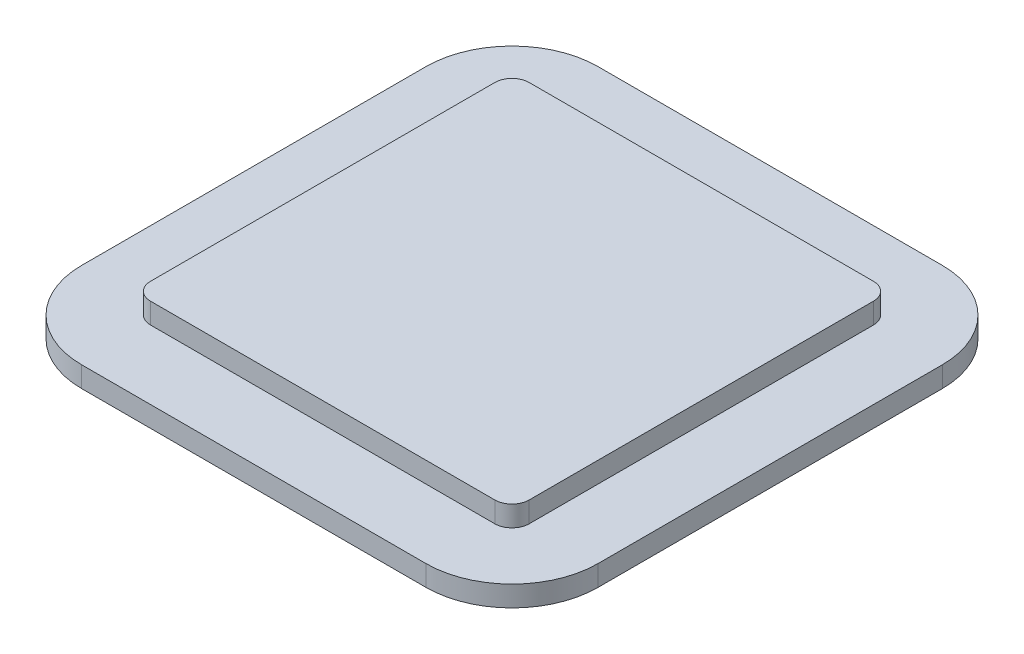
ISO-10303-21;
HEADER;
FILE_DESCRIPTION(('STEP AP214'),'2;1');
FILE_NAME('part.step','',(''),(''),'','','');
FILE_SCHEMA(('AUTOMOTIVE_DESIGN { 1 0 10303 214 1 1 1 1 }'));
ENDSEC;
DATA;
#1=APPLICATION_CONTEXT('core data for automotive mechanical design processes');
#2=APPLICATION_PROTOCOL_DEFINITION('international standard','automotive_design',2000,#1);
#3=PRODUCT_CONTEXT('',#1,'mechanical');
#4=PRODUCT('Part','Part','',(#3));
#5=PRODUCT_RELATED_PRODUCT_CATEGORY('part','',(#4));
#6=PRODUCT_DEFINITION_FORMATION('','',#4);
#7=PRODUCT_DEFINITION_CONTEXT('part definition',#1,'design');
#8=PRODUCT_DEFINITION('design','',#6,#7);
#9=PRODUCT_DEFINITION_SHAPE('','',#8);
#10=(LENGTH_UNIT() NAMED_UNIT(*) SI_UNIT(.MILLI.,.METRE.));
#11=(NAMED_UNIT(*) PLANE_ANGLE_UNIT() SI_UNIT($,.RADIAN.));
#12=(NAMED_UNIT(*) SI_UNIT($,.STERADIAN.) SOLID_ANGLE_UNIT());
#13=UNCERTAINTY_MEASURE_WITH_UNIT(LENGTH_MEASURE(1.E-05),#10,'distance_accuracy_value','');
#14=(GEOMETRIC_REPRESENTATION_CONTEXT(3) GLOBAL_UNCERTAINTY_ASSIGNED_CONTEXT((#13)) GLOBAL_UNIT_ASSIGNED_CONTEXT((#10,
#11,#12)) REPRESENTATION_CONTEXT('',''));
#15=CARTESIAN_POINT('',(0.,0.,0.));
#16=DIRECTION('',(0.,0.,1.));
#17=DIRECTION('',(1.,0.,0.));
#18=AXIS2_PLACEMENT_3D('',#15,#16,#17);
#19=CARTESIAN_POINT('',(45.9950248756219,0.6,-36.2189054726368));
#20=DIRECTION('',(1.,0.,0.));
#21=DIRECTION('',(0.,0.,-1.));
#22=AXIS2_PLACEMENT_3D('',#19,#20,#21);
#23=PLANE('',#22);
#24=DIRECTION('',(0.,0.,1.));
#25=VECTOR('',#24,1.);
#26=CARTESIAN_POINT('',(45.9950248756219,0.6,-36.2189054726368));
#27=LINE('',#26,#25);
#28=CARTESIAN_POINT('',(45.9950248756219,0.6,-33.7189054726368));
#29=VERTEX_POINT('',#28);
#30=CARTESIAN_POINT('',(45.9950248756219,0.6,-23.7189054726368));
#31=VERTEX_POINT('',#30);
#32=EDGE_CURVE('E183',#29,#31,#27,.T.);
#33=ORIENTED_EDGE('',*,*,#32,.F.);
#34=DIRECTION('',(0.,-1.,0.));
#35=VECTOR('',#34,1.);
#36=CARTESIAN_POINT('',(45.9950248756219,0.6,-33.7189054726368));
#37=LINE('',#36,#35);
#38=CARTESIAN_POINT('',(45.9950248756219,0.,-33.7189054726368));
#39=VERTEX_POINT('',#38);
#40=EDGE_CURVE('E211',#29,#39,#37,.T.);
#41=ORIENTED_EDGE('',*,*,#40,.T.);
#42=DIRECTION('',(0.,0.,1.));
#43=VECTOR('',#42,1.);
#44=CARTESIAN_POINT('',(45.9950248756219,0.,-36.2189054726368));
#45=LINE('',#44,#43);
#46=CARTESIAN_POINT('',(45.9950248756219,0.,-23.7189054726368));
#47=VERTEX_POINT('',#46);
#48=EDGE_CURVE('E287',#39,#47,#45,.T.);
#49=ORIENTED_EDGE('',*,*,#48,.T.);
#50=DIRECTION('',(0.,-1.,0.));
#51=VECTOR('',#50,1.);
#52=CARTESIAN_POINT('',(45.9950248756219,0.6,-23.7189054726368));
#53=LINE('',#52,#51);
#54=EDGE_CURVE('E209',#47,#31,#53,.F.);
#55=ORIENTED_EDGE('',*,*,#54,.T.);
#56=EDGE_LOOP('',(#33,#41,#49,#55));
#57=FACE_BOUND('',#56,.T.);
#58=ADVANCED_FACE('F45',(#57),#23,.F.);
#59=CARTESIAN_POINT('',(45.9950248756219,0.6,-21.2189054726368));
#60=DIRECTION('',(0.,0.,-1.));
#61=DIRECTION('',(-1.,0.,0.));
#62=AXIS2_PLACEMENT_3D('',#59,#60,#61);
#63=PLANE('',#62);
#64=DIRECTION('',(1.,0.,0.));
#65=VECTOR('',#64,1.);
#66=CARTESIAN_POINT('',(45.9950248756219,0.,-21.2189054726368));
#67=LINE('',#66,#65);
#68=CARTESIAN_POINT('',(48.4950248756219,0.,-21.2189054726368));
#69=VERTEX_POINT('',#68);
#70=CARTESIAN_POINT('',(58.4950248756219,0.,-21.2189054726368));
#71=VERTEX_POINT('',#70);
#72=EDGE_CURVE('E189',#69,#71,#67,.T.);
#73=ORIENTED_EDGE('',*,*,#72,.T.);
#74=DIRECTION('',(0.,-1.,0.));
#75=VECTOR('',#74,1.);
#76=CARTESIAN_POINT('',(58.4950248756219,0.6,-21.2189054726368));
#77=LINE('',#76,#75);
#78=CARTESIAN_POINT('',(58.4950248756219,0.6,-21.2189054726368));
#79=VERTEX_POINT('',#78);
#80=EDGE_CURVE('E217',#71,#79,#77,.F.);
#81=ORIENTED_EDGE('',*,*,#80,.T.);
#82=DIRECTION('',(1.,0.,0.));
#83=VECTOR('',#82,1.);
#84=CARTESIAN_POINT('',(45.9950248756219,0.6,-21.2189054726368));
#85=LINE('',#84,#83);
#86=CARTESIAN_POINT('',(48.4950248756219,0.6,-21.2189054726368));
#87=VERTEX_POINT('',#86);
#88=EDGE_CURVE('E187',#87,#79,#85,.T.);
#89=ORIENTED_EDGE('',*,*,#88,.F.);
#90=DIRECTION('',(0.,-1.,0.));
#91=VECTOR('',#90,1.);
#92=CARTESIAN_POINT('',(48.4950248756219,0.6,-21.2189054726368));
#93=LINE('',#92,#91);
#94=EDGE_CURVE('E214',#87,#69,#93,.T.);
#95=ORIENTED_EDGE('',*,*,#94,.T.);
#96=EDGE_LOOP('',(#73,#81,#89,#95));
#97=FACE_BOUND('',#96,.T.);
#98=ADVANCED_FACE('F304',(#97),#63,.F.);
#99=CARTESIAN_POINT('',(60.9950248756219,0.6,-36.2189054726368));
#100=DIRECTION('',(-1.,0.,0.));
#101=DIRECTION('',(0.,0.,1.));
#102=AXIS2_PLACEMENT_3D('',#99,#100,#101);
#103=PLANE('',#102);
#104=DIRECTION('',(0.,0.,-1.));
#105=VECTOR('',#104,1.);
#106=CARTESIAN_POINT('',(60.9950248756219,0.,-36.2189054726368));
#107=LINE('',#106,#105);
#108=CARTESIAN_POINT('',(60.9950248756219,0.,-23.7189054726368));
#109=VERTEX_POINT('',#108);
#110=CARTESIAN_POINT('',(60.9950248756219,0.,-33.7189054726368));
#111=VERTEX_POINT('',#110);
#112=EDGE_CURVE('E184',#109,#111,#107,.T.);
#113=ORIENTED_EDGE('',*,*,#112,.T.);
#114=DIRECTION('',(0.,-1.,0.));
#115=VECTOR('',#114,1.);
#116=CARTESIAN_POINT('',(60.9950248756219,0.6,-33.7189054726368));
#117=LINE('',#116,#115);
#118=CARTESIAN_POINT('',(60.9950248756219,0.6,-33.7189054726368));
#119=VERTEX_POINT('',#118);
#120=EDGE_CURVE('E162',#111,#119,#117,.F.);
#121=ORIENTED_EDGE('',*,*,#120,.T.);
#122=DIRECTION('',(0.,0.,-1.));
#123=VECTOR('',#122,1.);
#124=CARTESIAN_POINT('',(60.9950248756219,0.6,-36.2189054726368));
#125=LINE('',#124,#123);
#126=CARTESIAN_POINT('',(60.9950248756219,0.6,-23.7189054726368));
#127=VERTEX_POINT('',#126);
#128=EDGE_CURVE('E295',#127,#119,#125,.T.);
#129=ORIENTED_EDGE('',*,*,#128,.F.);
#130=DIRECTION('',(0.,-1.,0.));
#131=VECTOR('',#130,1.);
#132=CARTESIAN_POINT('',(60.9950248756219,0.6,-23.7189054726368));
#133=LINE('',#132,#131);
#134=EDGE_CURVE('E167',#127,#109,#133,.T.);
#135=ORIENTED_EDGE('',*,*,#134,.T.);
#136=EDGE_LOOP('',(#113,#121,#129,#135));
#137=FACE_BOUND('',#136,.T.);
#138=ADVANCED_FACE('F313',(#137),#103,.F.);
#139=CARTESIAN_POINT('',(45.9950248756219,0.6,-36.2189054726368));
#140=DIRECTION('',(0.,0.,1.));
#141=DIRECTION('',(1.,0.,0.));
#142=AXIS2_PLACEMENT_3D('',#139,#140,#141);
#143=PLANE('',#142);
#144=DIRECTION('',(-1.,0.,0.));
#145=VECTOR('',#144,1.);
#146=CARTESIAN_POINT('',(45.9950248756219,0.6,-36.2189054726368));
#147=LINE('',#146,#145);
#148=CARTESIAN_POINT('',(58.4950248756219,0.6,-36.2189054726368));
#149=VERTEX_POINT('',#148);
#150=CARTESIAN_POINT('',(48.4950248756219,0.6,-36.2189054726368));
#151=VERTEX_POINT('',#150);
#152=EDGE_CURVE('E177',#149,#151,#147,.T.);
#153=ORIENTED_EDGE('',*,*,#152,.F.);
#154=DIRECTION('',(0.,-1.,0.));
#155=VECTOR('',#154,1.);
#156=CARTESIAN_POINT('',(58.4950248756219,0.6,-36.2189054726368));
#157=LINE('',#156,#155);
#158=CARTESIAN_POINT('',(58.4950248756219,0.,-36.2189054726368));
#159=VERTEX_POINT('',#158);
#160=EDGE_CURVE('E161',#149,#159,#157,.T.);
#161=ORIENTED_EDGE('',*,*,#160,.T.);
#162=DIRECTION('',(-1.,0.,0.));
#163=VECTOR('',#162,1.);
#164=CARTESIAN_POINT('',(45.9950248756219,0.,-36.2189054726368));
#165=LINE('',#164,#163);
#166=CARTESIAN_POINT('',(48.4950248756219,0.,-36.2189054726368));
#167=VERTEX_POINT('',#166);
#168=EDGE_CURVE('E174',#159,#167,#165,.T.);
#169=ORIENTED_EDGE('',*,*,#168,.T.);
#170=DIRECTION('',(0.,-1.,0.));
#171=VECTOR('',#170,1.);
#172=CARTESIAN_POINT('',(48.4950248756219,0.6,-36.2189054726368));
#173=LINE('',#172,#171);
#174=EDGE_CURVE('E179',#167,#151,#173,.F.);
#175=ORIENTED_EDGE('',*,*,#174,.T.);
#176=EDGE_LOOP('',(#153,#161,#169,#175));
#177=FACE_BOUND('',#176,.T.);
#178=ADVANCED_FACE('F173',(#177),#143,.F.);
#179=CARTESIAN_POINT('',(0.,0.6,0.));
#180=DIRECTION('',(0.,1.,0.));
#181=DIRECTION('',(0.,0.,1.));
#182=AXIS2_PLACEMENT_3D('',#179,#180,#181);
#183=PLANE('',#182);
#184=DIRECTION('',(0.,0.,1.));
#185=VECTOR('',#184,1.);
#186=CARTESIAN_POINT('',(47.9950248756219,0.6,-34.2189054726368));
#187=LINE('',#186,#185);
#188=CARTESIAN_POINT('',(47.9950248756219,0.6,-33.7189054726368));
#189=VERTEX_POINT('',#188);
#190=CARTESIAN_POINT('',(47.9950248756219,0.6,-23.7189054726368));
#191=VERTEX_POINT('',#190);
#192=EDGE_CURVE('E256',#189,#191,#187,.T.);
#193=ORIENTED_EDGE('',*,*,#192,.F.);
#194=CARTESIAN_POINT('',(48.4950248756219,0.6,-33.7189054726368));
#195=DIRECTION('',(0.,1.,0.));
#196=DIRECTION('',(0.,0.,1.));
#197=AXIS2_PLACEMENT_3D('',#194,#195,#196);
#198=CIRCLE('',#197,0.5);
#199=CARTESIAN_POINT('',(48.4950248756219,0.6,-34.2189054726368));
#200=VERTEX_POINT('',#199);
#201=EDGE_CURVE('E248',#189,#200,#198,.F.);
#202=ORIENTED_EDGE('',*,*,#201,.T.);
#203=DIRECTION('',(-1.,0.,0.));
#204=VECTOR('',#203,1.);
#205=CARTESIAN_POINT('',(47.9950248756219,0.6,-34.2189054726368));
#206=LINE('',#205,#204);
#207=CARTESIAN_POINT('',(58.4950248756219,0.6,-34.2189054726368));
#208=VERTEX_POINT('',#207);
#209=EDGE_CURVE('E254',#208,#200,#206,.T.);
#210=ORIENTED_EDGE('',*,*,#209,.F.);
#211=CARTESIAN_POINT('',(58.4950248756219,0.6,-33.7189054726368));
#212=DIRECTION('',(0.,1.,0.));
#213=DIRECTION('',(0.,0.,1.));
#214=AXIS2_PLACEMENT_3D('',#211,#212,#213);
#215=CIRCLE('',#214,0.5);
#216=CARTESIAN_POINT('',(58.9950248756219,0.6,-33.7189054726368));
#217=VERTEX_POINT('',#216);
#218=EDGE_CURVE('E246',#208,#217,#215,.F.);
#219=ORIENTED_EDGE('',*,*,#218,.T.);
#220=DIRECTION('',(0.,0.,-1.));
#221=VECTOR('',#220,1.);
#222=CARTESIAN_POINT('',(58.9950248756219,0.6,-34.2189054726368));
#223=LINE('',#222,#221);
#224=CARTESIAN_POINT('',(58.9950248756219,0.6,-23.7189054726368));
#225=VERTEX_POINT('',#224);
#226=EDGE_CURVE('E266',#225,#217,#223,.T.);
#227=ORIENTED_EDGE('',*,*,#226,.F.);
#228=CARTESIAN_POINT('',(58.4950248756219,0.6,-23.7189054726368));
#229=DIRECTION('',(0.,1.,0.));
#230=DIRECTION('',(0.,0.,1.));
#231=AXIS2_PLACEMENT_3D('',#228,#229,#230);
#232=CIRCLE('',#231,0.5);
#233=CARTESIAN_POINT('',(58.4950248756219,0.6,-23.2189054726368));
#234=VERTEX_POINT('',#233);
#235=EDGE_CURVE('E53',#225,#234,#232,.F.);
#236=ORIENTED_EDGE('',*,*,#235,.T.);
#237=DIRECTION('',(1.,0.,0.));
#238=VECTOR('',#237,1.);
#239=CARTESIAN_POINT('',(47.9950248756219,0.6,-23.2189054726368));
#240=LINE('',#239,#238);
#241=CARTESIAN_POINT('',(48.4950248756219,0.6,-23.2189054726368));
#242=VERTEX_POINT('',#241);
#243=EDGE_CURVE('E289',#242,#234,#240,.T.);
#244=ORIENTED_EDGE('',*,*,#243,.F.);
#245=CARTESIAN_POINT('',(48.4950248756219,0.6,-23.7189054726368));
#246=DIRECTION('',(0.,1.,0.));
#247=DIRECTION('',(0.,0.,1.));
#248=AXIS2_PLACEMENT_3D('',#245,#246,#247);
#249=CIRCLE('',#248,0.5);
#250=EDGE_CURVE('E11',#242,#191,#249,.F.);
#251=ORIENTED_EDGE('',*,*,#250,.T.);
#252=EDGE_LOOP('',(#193,#202,#210,#219,#227,#236,#244,#251));
#253=FACE_BOUND('',#252,.T.);
#254=ORIENTED_EDGE('',*,*,#128,.T.);
#255=CARTESIAN_POINT('',(58.4950248756219,0.6,-33.7189054726368));
#256=DIRECTION('',(0.,1.,0.));
#257=DIRECTION('',(0.,0.,1.));
#258=AXIS2_PLACEMENT_3D('',#255,#256,#257);
#259=CIRCLE('',#258,2.5);
#260=EDGE_CURVE('E207',#119,#149,#259,.T.);
#261=ORIENTED_EDGE('',*,*,#260,.T.);
#262=ORIENTED_EDGE('',*,*,#152,.T.);
#263=CARTESIAN_POINT('',(48.4950248756219,0.6,-33.7189054726368));
#264=DIRECTION('',(0.,1.,0.));
#265=DIRECTION('',(0.,0.,1.));
#266=AXIS2_PLACEMENT_3D('',#263,#264,#265);
#267=CIRCLE('',#266,2.5);
#268=EDGE_CURVE('E205',#151,#29,#267,.T.);
#269=ORIENTED_EDGE('',*,*,#268,.T.);
#270=ORIENTED_EDGE('',*,*,#32,.T.);
#271=CARTESIAN_POINT('',(48.4950248756219,0.6,-23.7189054726368));
#272=DIRECTION('',(0.,1.,0.));
#273=DIRECTION('',(0.,0.,1.));
#274=AXIS2_PLACEMENT_3D('',#271,#272,#273);
#275=CIRCLE('',#274,2.5);
#276=EDGE_CURVE('E201',#31,#87,#275,.T.);
#277=ORIENTED_EDGE('',*,*,#276,.T.);
#278=ORIENTED_EDGE('',*,*,#88,.T.);
#279=CARTESIAN_POINT('',(58.4950248756219,0.6,-23.7189054726368));
#280=DIRECTION('',(0.,1.,0.));
#281=DIRECTION('',(0.,0.,1.));
#282=AXIS2_PLACEMENT_3D('',#279,#280,#281);
#283=CIRCLE('',#282,2.5);
#284=EDGE_CURVE('E203',#79,#127,#283,.T.);
#285=ORIENTED_EDGE('',*,*,#284,.T.);
#286=EDGE_LOOP('',(#254,#261,#262,#269,#270,#277,#278,#285));
#287=FACE_BOUND('',#286,.T.);
#288=ADVANCED_FACE('F252',(#253,#287),#183,.T.);
#289=CARTESIAN_POINT('',(0.,0.,0.));
#290=DIRECTION('',(0.,1.,0.));
#291=DIRECTION('',(0.,0.,1.));
#292=AXIS2_PLACEMENT_3D('',#289,#290,#291);
#293=PLANE('',#292);
#294=ORIENTED_EDGE('',*,*,#168,.F.);
#295=CARTESIAN_POINT('',(58.4950248756219,0.,-33.7189054726368));
#296=DIRECTION('',(0.,1.,0.));
#297=DIRECTION('',(0.,0.,1.));
#298=AXIS2_PLACEMENT_3D('',#295,#296,#297);
#299=CIRCLE('',#298,2.5);
#300=EDGE_CURVE('E157',#159,#111,#299,.F.);
#301=ORIENTED_EDGE('',*,*,#300,.T.);
#302=ORIENTED_EDGE('',*,*,#112,.F.);
#303=CARTESIAN_POINT('',(58.4950248756219,0.,-23.7189054726368));
#304=DIRECTION('',(0.,1.,0.));
#305=DIRECTION('',(0.,0.,1.));
#306=AXIS2_PLACEMENT_3D('',#303,#304,#305);
#307=CIRCLE('',#306,2.5);
#308=EDGE_CURVE('E195',#109,#71,#307,.F.);
#309=ORIENTED_EDGE('',*,*,#308,.T.);
#310=ORIENTED_EDGE('',*,*,#72,.F.);
#311=CARTESIAN_POINT('',(48.4950248756219,0.,-23.7189054726368));
#312=DIRECTION('',(0.,1.,0.));
#313=DIRECTION('',(0.,0.,1.));
#314=AXIS2_PLACEMENT_3D('',#311,#312,#313);
#315=CIRCLE('',#314,2.5);
#316=EDGE_CURVE('E178',#69,#47,#315,.F.);
#317=ORIENTED_EDGE('',*,*,#316,.T.);
#318=ORIENTED_EDGE('',*,*,#48,.F.);
#319=CARTESIAN_POINT('',(48.4950248756219,0.,-33.7189054726368));
#320=DIRECTION('',(0.,1.,0.));
#321=DIRECTION('',(0.,0.,1.));
#322=AXIS2_PLACEMENT_3D('',#319,#320,#321);
#323=CIRCLE('',#322,2.5);
#324=EDGE_CURVE('E168',#39,#167,#323,.F.);
#325=ORIENTED_EDGE('',*,*,#324,.T.);
#326=EDGE_LOOP('',(#294,#301,#302,#309,#310,#317,#318,#325));
#327=FACE_BOUND('',#326,.T.);
#328=ADVANCED_FACE('F181',(#327),#293,.F.);
#329=CARTESIAN_POINT('',(58.4950248756219,0.6,-33.7189054726368));
#330=DIRECTION('',(0.,-1.,0.));
#331=DIRECTION('',(0.,0.,-1.));
#332=AXIS2_PLACEMENT_3D('',#329,#330,#331);
#333=CYLINDRICAL_SURFACE('',#332,2.5);
#334=ORIENTED_EDGE('',*,*,#260,.F.);
#335=ORIENTED_EDGE('',*,*,#120,.F.);
#336=ORIENTED_EDGE('',*,*,#300,.F.);
#337=ORIENTED_EDGE('',*,*,#160,.F.);
#338=EDGE_LOOP('',(#334,#335,#336,#337));
#339=FACE_BOUND('',#338,.T.);
#340=ADVANCED_FACE('F160',(#339),#333,.T.);
#341=CARTESIAN_POINT('',(48.4950248756219,0.6,-33.7189054726368));
#342=DIRECTION('',(0.,-1.,0.));
#343=DIRECTION('',(0.,0.,-1.));
#344=AXIS2_PLACEMENT_3D('',#341,#342,#343);
#345=CYLINDRICAL_SURFACE('',#344,2.5);
#346=ORIENTED_EDGE('',*,*,#268,.F.);
#347=ORIENTED_EDGE('',*,*,#174,.F.);
#348=ORIENTED_EDGE('',*,*,#324,.F.);
#349=ORIENTED_EDGE('',*,*,#40,.F.);
#350=EDGE_LOOP('',(#346,#347,#348,#349));
#351=FACE_BOUND('',#350,.T.);
#352=ADVANCED_FACE('F331',(#351),#345,.T.);
#353=CARTESIAN_POINT('',(58.4950248756219,0.6,-23.7189054726368));
#354=DIRECTION('',(0.,-1.,0.));
#355=DIRECTION('',(0.,0.,-1.));
#356=AXIS2_PLACEMENT_3D('',#353,#354,#355);
#357=CYLINDRICAL_SURFACE('',#356,2.5);
#358=ORIENTED_EDGE('',*,*,#284,.F.);
#359=ORIENTED_EDGE('',*,*,#80,.F.);
#360=ORIENTED_EDGE('',*,*,#308,.F.);
#361=ORIENTED_EDGE('',*,*,#134,.F.);
#362=EDGE_LOOP('',(#358,#359,#360,#361));
#363=FACE_BOUND('',#362,.T.);
#364=ADVANCED_FACE('F309',(#363),#357,.T.);
#365=CARTESIAN_POINT('',(48.4950248756219,0.6,-23.7189054726368));
#366=DIRECTION('',(0.,-1.,0.));
#367=DIRECTION('',(0.,0.,-1.));
#368=AXIS2_PLACEMENT_3D('',#365,#366,#367);
#369=CYLINDRICAL_SURFACE('',#368,2.5);
#370=ORIENTED_EDGE('',*,*,#276,.F.);
#371=ORIENTED_EDGE('',*,*,#54,.F.);
#372=ORIENTED_EDGE('',*,*,#316,.F.);
#373=ORIENTED_EDGE('',*,*,#94,.F.);
#374=EDGE_LOOP('',(#370,#371,#372,#373));
#375=FACE_BOUND('',#374,.T.);
#376=ADVANCED_FACE('F337',(#375),#369,.T.);
#377=CARTESIAN_POINT('',(47.9950248756219,1.2,-34.2189054726368));
#378=DIRECTION('',(1.,0.,0.));
#379=DIRECTION('',(0.,0.,-1.));
#380=AXIS2_PLACEMENT_3D('',#377,#378,#379);
#381=PLANE('',#380);
#382=DIRECTION('',(0.,0.,1.));
#383=VECTOR('',#382,1.);
#384=CARTESIAN_POINT('',(47.9950248756219,1.2,-34.2189054726368));
#385=LINE('',#384,#383);
#386=CARTESIAN_POINT('',(47.9950248756219,1.2,-33.7189054726368));
#387=VERTEX_POINT('',#386);
#388=CARTESIAN_POINT('',(47.9950248756219,1.2,-23.7189054726368));
#389=VERTEX_POINT('',#388);
#390=EDGE_CURVE('E265',#387,#389,#385,.T.);
#391=ORIENTED_EDGE('',*,*,#390,.F.);
#392=DIRECTION('',(0.,-1.,0.));
#393=VECTOR('',#392,1.);
#394=CARTESIAN_POINT('',(47.9950248756219,1.2,-33.7189054726368));
#395=LINE('',#394,#393);
#396=EDGE_CURVE('E239',#387,#189,#395,.T.);
#397=ORIENTED_EDGE('',*,*,#396,.T.);
#398=ORIENTED_EDGE('',*,*,#192,.T.);
#399=DIRECTION('',(0.,-1.,0.));
#400=VECTOR('',#399,1.);
#401=CARTESIAN_POINT('',(47.9950248756219,1.2,-23.7189054726368));
#402=LINE('',#401,#400);
#403=EDGE_CURVE('E237',#191,#389,#402,.F.);
#404=ORIENTED_EDGE('',*,*,#403,.T.);
#405=EDGE_LOOP('',(#391,#397,#398,#404));
#406=FACE_BOUND('',#405,.T.);
#407=ADVANCED_FACE('F278',(#406),#381,.F.);
#408=CARTESIAN_POINT('',(47.9950248756219,1.2,-23.2189054726368));
#409=DIRECTION('',(0.,0.,-1.));
#410=DIRECTION('',(-1.,0.,0.));
#411=AXIS2_PLACEMENT_3D('',#408,#409,#410);
#412=PLANE('',#411);
#413=ORIENTED_EDGE('',*,*,#243,.T.);
#414=DIRECTION('',(0.,-1.,0.));
#415=VECTOR('',#414,1.);
#416=CARTESIAN_POINT('',(58.4950248756219,1.2,-23.2189054726368));
#417=LINE('',#416,#415);
#418=CARTESIAN_POINT('',(58.4950248756219,1.2,-23.2189054726368));
#419=VERTEX_POINT('',#418);
#420=EDGE_CURVE('E244',#234,#419,#417,.F.);
#421=ORIENTED_EDGE('',*,*,#420,.T.);
#422=DIRECTION('',(1.,0.,0.));
#423=VECTOR('',#422,1.);
#424=CARTESIAN_POINT('',(47.9950248756219,1.2,-23.2189054726368));
#425=LINE('',#424,#423);
#426=CARTESIAN_POINT('',(48.4950248756219,1.2,-23.2189054726368));
#427=VERTEX_POINT('',#426);
#428=EDGE_CURVE('E279',#427,#419,#425,.T.);
#429=ORIENTED_EDGE('',*,*,#428,.F.);
#430=DIRECTION('',(0.,-1.,0.));
#431=VECTOR('',#430,1.);
#432=CARTESIAN_POINT('',(48.4950248756219,1.2,-23.2189054726368));
#433=LINE('',#432,#431);
#434=EDGE_CURVE('E242',#427,#242,#433,.T.);
#435=ORIENTED_EDGE('',*,*,#434,.T.);
#436=EDGE_LOOP('',(#413,#421,#429,#435));
#437=FACE_BOUND('',#436,.T.);
#438=ADVANCED_FACE('F362',(#437),#412,.F.);
#439=CARTESIAN_POINT('',(58.9950248756219,1.2,-34.2189054726368));
#440=DIRECTION('',(-1.,0.,0.));
#441=DIRECTION('',(0.,0.,1.));
#442=AXIS2_PLACEMENT_3D('',#439,#440,#441);
#443=PLANE('',#442);
#444=ORIENTED_EDGE('',*,*,#226,.T.);
#445=DIRECTION('',(0.,-1.,0.));
#446=VECTOR('',#445,1.);
#447=CARTESIAN_POINT('',(58.9950248756219,1.2,-33.7189054726368));
#448=LINE('',#447,#446);
#449=CARTESIAN_POINT('',(58.9950248756219,1.2,-33.7189054726368));
#450=VERTEX_POINT('',#449);
#451=EDGE_CURVE('E227',#217,#450,#448,.F.);
#452=ORIENTED_EDGE('',*,*,#451,.T.);
#453=DIRECTION('',(0.,0.,-1.));
#454=VECTOR('',#453,1.);
#455=CARTESIAN_POINT('',(58.9950248756219,1.2,-34.2189054726368));
#456=LINE('',#455,#454);
#457=CARTESIAN_POINT('',(58.9950248756219,1.2,-23.7189054726368));
#458=VERTEX_POINT('',#457);
#459=EDGE_CURVE('E282',#458,#450,#456,.T.);
#460=ORIENTED_EDGE('',*,*,#459,.F.);
#461=DIRECTION('',(0.,-1.,0.));
#462=VECTOR('',#461,1.);
#463=CARTESIAN_POINT('',(58.9950248756219,1.2,-23.7189054726368));
#464=LINE('',#463,#462);
#465=EDGE_CURVE('E224',#458,#225,#464,.T.);
#466=ORIENTED_EDGE('',*,*,#465,.T.);
#467=EDGE_LOOP('',(#444,#452,#460,#466));
#468=FACE_BOUND('',#467,.T.);
#469=ADVANCED_FACE('F359',(#468),#443,.F.);
#470=CARTESIAN_POINT('',(47.9950248756219,1.2,-34.2189054726368));
#471=DIRECTION('',(0.,0.,1.));
#472=DIRECTION('',(1.,0.,0.));
#473=AXIS2_PLACEMENT_3D('',#470,#471,#472);
#474=PLANE('',#473);
#475=DIRECTION('',(-1.,0.,0.));
#476=VECTOR('',#475,1.);
#477=CARTESIAN_POINT('',(47.9950248756219,1.2,-34.2189054726368));
#478=LINE('',#477,#476);
#479=CARTESIAN_POINT('',(58.4950248756219,1.2,-34.2189054726368));
#480=VERTEX_POINT('',#479);
#481=CARTESIAN_POINT('',(48.4950248756219,1.2,-34.2189054726368));
#482=VERTEX_POINT('',#481);
#483=EDGE_CURVE('E276',#480,#482,#478,.T.);
#484=ORIENTED_EDGE('',*,*,#483,.F.);
#485=DIRECTION('',(0.,-1.,0.));
#486=VECTOR('',#485,1.);
#487=CARTESIAN_POINT('',(58.4950248756219,1.2,-34.2189054726368));
#488=LINE('',#487,#486);
#489=EDGE_CURVE('E221',#480,#208,#488,.T.);
#490=ORIENTED_EDGE('',*,*,#489,.T.);
#491=ORIENTED_EDGE('',*,*,#209,.T.);
#492=DIRECTION('',(0.,-1.,0.));
#493=VECTOR('',#492,1.);
#494=CARTESIAN_POINT('',(48.4950248756219,1.2,-34.2189054726368));
#495=LINE('',#494,#493);
#496=EDGE_CURVE('E219',#200,#482,#495,.F.);
#497=ORIENTED_EDGE('',*,*,#496,.T.);
#498=EDGE_LOOP('',(#484,#490,#491,#497));
#499=FACE_BOUND('',#498,.T.);
#500=ADVANCED_FACE('F262',(#499),#474,.F.);
#501=CARTESIAN_POINT('',(0.,1.2,0.));
#502=DIRECTION('',(0.,1.,0.));
#503=DIRECTION('',(0.,0.,1.));
#504=AXIS2_PLACEMENT_3D('',#501,#502,#503);
#505=PLANE('',#504);
#506=ORIENTED_EDGE('',*,*,#459,.T.);
#507=CARTESIAN_POINT('',(58.4950248756219,1.2,-33.7189054726368));
#508=DIRECTION('',(0.,1.,0.));
#509=DIRECTION('',(0.,0.,1.));
#510=AXIS2_PLACEMENT_3D('',#507,#508,#509);
#511=CIRCLE('',#510,0.5);
#512=EDGE_CURVE('E235',#450,#480,#511,.T.);
#513=ORIENTED_EDGE('',*,*,#512,.T.);
#514=ORIENTED_EDGE('',*,*,#483,.T.);
#515=CARTESIAN_POINT('',(48.4950248756219,1.2,-33.7189054726368));
#516=DIRECTION('',(0.,1.,0.));
#517=DIRECTION('',(0.,0.,1.));
#518=AXIS2_PLACEMENT_3D('',#515,#516,#517);
#519=CIRCLE('',#518,0.5);
#520=EDGE_CURVE('E233',#482,#387,#519,.T.);
#521=ORIENTED_EDGE('',*,*,#520,.T.);
#522=ORIENTED_EDGE('',*,*,#390,.T.);
#523=CARTESIAN_POINT('',(48.4950248756219,1.2,-23.7189054726368));
#524=DIRECTION('',(0.,1.,0.));
#525=DIRECTION('',(0.,0.,1.));
#526=AXIS2_PLACEMENT_3D('',#523,#524,#525);
#527=CIRCLE('',#526,0.5);
#528=EDGE_CURVE('E229',#389,#427,#527,.T.);
#529=ORIENTED_EDGE('',*,*,#528,.T.);
#530=ORIENTED_EDGE('',*,*,#428,.T.);
#531=CARTESIAN_POINT('',(58.4950248756219,1.2,-23.7189054726368));
#532=DIRECTION('',(0.,1.,0.));
#533=DIRECTION('',(0.,0.,1.));
#534=AXIS2_PLACEMENT_3D('',#531,#532,#533);
#535=CIRCLE('',#534,0.5);
#536=EDGE_CURVE('E231',#419,#458,#535,.T.);
#537=ORIENTED_EDGE('',*,*,#536,.T.);
#538=EDGE_LOOP('',(#506,#513,#514,#521,#522,#529,#530,#537));
#539=FACE_BOUND('',#538,.T.);
#540=ADVANCED_FACE('F274',(#539),#505,.T.);
#541=CARTESIAN_POINT('',(58.4950248756219,1.2,-33.7189054726368));
#542=DIRECTION('',(0.,-1.,0.));
#543=DIRECTION('',(0.,0.,-1.));
#544=AXIS2_PLACEMENT_3D('',#541,#542,#543);
#545=CYLINDRICAL_SURFACE('',#544,0.5);
#546=ORIENTED_EDGE('',*,*,#512,.F.);
#547=ORIENTED_EDGE('',*,*,#451,.F.);
#548=ORIENTED_EDGE('',*,*,#218,.F.);
#549=ORIENTED_EDGE('',*,*,#489,.F.);
#550=EDGE_LOOP('',(#546,#547,#548,#549));
#551=FACE_BOUND('',#550,.T.);
#552=ADVANCED_FACE('F341',(#551),#545,.T.);
#553=CARTESIAN_POINT('',(48.4950248756219,1.2,-33.7189054726368));
#554=DIRECTION('',(0.,-1.,0.));
#555=DIRECTION('',(0.,0.,-1.));
#556=AXIS2_PLACEMENT_3D('',#553,#554,#555);
#557=CYLINDRICAL_SURFACE('',#556,0.5);
#558=ORIENTED_EDGE('',*,*,#520,.F.);
#559=ORIENTED_EDGE('',*,*,#496,.F.);
#560=ORIENTED_EDGE('',*,*,#201,.F.);
#561=ORIENTED_EDGE('',*,*,#396,.F.);
#562=EDGE_LOOP('',(#558,#559,#560,#561));
#563=FACE_BOUND('',#562,.T.);
#564=ADVANCED_FACE('F269',(#563),#557,.T.);
#565=CARTESIAN_POINT('',(58.4950248756219,1.2,-23.7189054726368));
#566=DIRECTION('',(0.,-1.,0.));
#567=DIRECTION('',(0.,0.,-1.));
#568=AXIS2_PLACEMENT_3D('',#565,#566,#567);
#569=CYLINDRICAL_SURFACE('',#568,0.5);
#570=ORIENTED_EDGE('',*,*,#536,.F.);
#571=ORIENTED_EDGE('',*,*,#420,.F.);
#572=ORIENTED_EDGE('',*,*,#235,.F.);
#573=ORIENTED_EDGE('',*,*,#465,.F.);
#574=EDGE_LOOP('',(#570,#571,#572,#573));
#575=FACE_BOUND('',#574,.T.);
#576=ADVANCED_FACE('F346',(#575),#569,.T.);
#577=CARTESIAN_POINT('',(48.4950248756219,1.2,-23.7189054726368));
#578=DIRECTION('',(0.,-1.,0.));
#579=DIRECTION('',(0.,0.,-1.));
#580=AXIS2_PLACEMENT_3D('',#577,#578,#579);
#581=CYLINDRICAL_SURFACE('',#580,0.5);
#582=ORIENTED_EDGE('',*,*,#528,.F.);
#583=ORIENTED_EDGE('',*,*,#403,.F.);
#584=ORIENTED_EDGE('',*,*,#250,.F.);
#585=ORIENTED_EDGE('',*,*,#434,.F.);
#586=EDGE_LOOP('',(#582,#583,#584,#585));
#587=FACE_BOUND('',#586,.T.);
#588=ADVANCED_FACE('F47',(#587),#581,.T.);
#589=CLOSED_SHELL('',(#58,#98,#138,#178,#288,#328,#340,#352,#364,#376,#407,#438,#469,#500,#540,
#552,#564,#576,#588));
#590=MANIFOLD_SOLID_BREP('B2',#589);
#591=ADVANCED_BREP_SHAPE_REPRESENTATION('',(#18,#590),#14);
#592=SHAPE_DEFINITION_REPRESENTATION(#9,#591);
ENDSEC;
END-ISO-10303-21;
